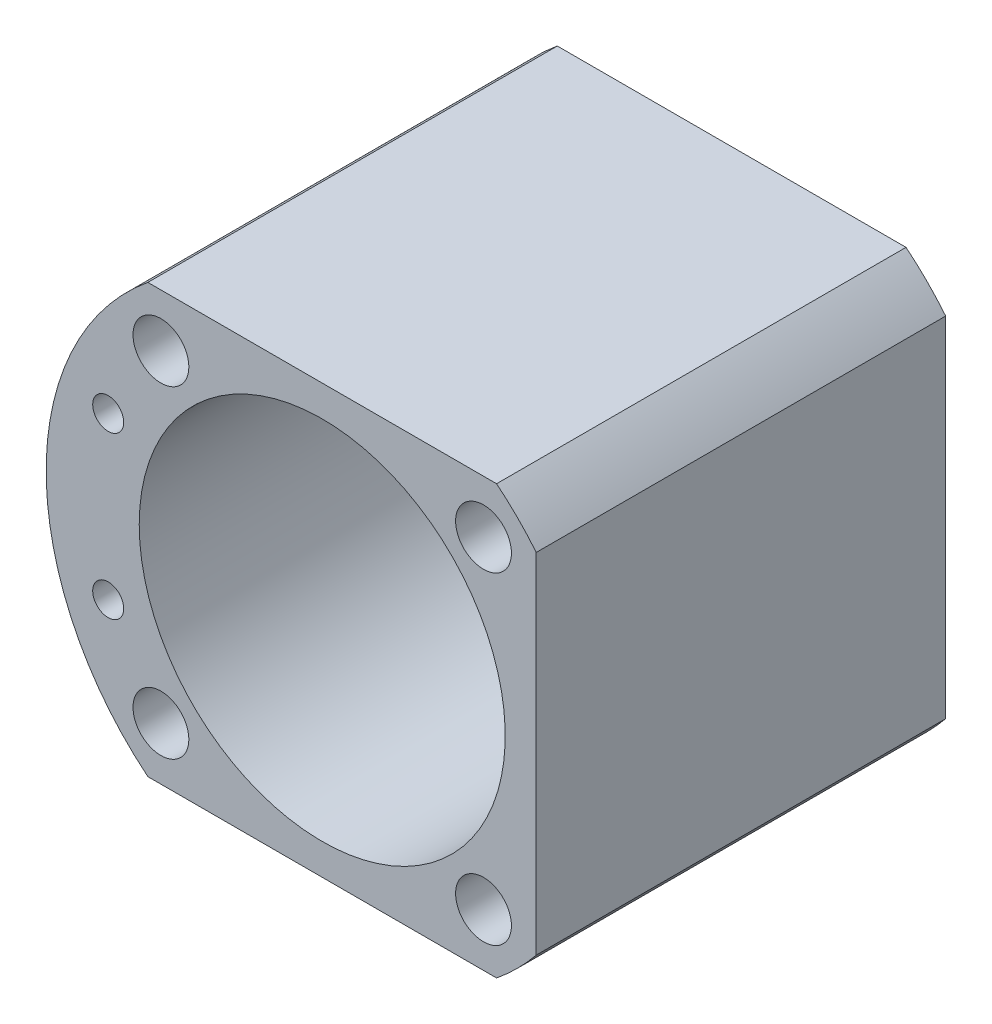
ISO-10303-21;
HEADER;
FILE_DESCRIPTION(('STEP AP214'),'2;1');
FILE_NAME('part.step','',(''),(''),'','','');
FILE_SCHEMA(('AUTOMOTIVE_DESIGN { 1 0 10303 214 1 1 1 1 }'));
ENDSEC;
DATA;
#1=APPLICATION_CONTEXT('core data for automotive mechanical design processes');
#2=APPLICATION_PROTOCOL_DEFINITION('international standard','automotive_design',2000,#1);
#3=PRODUCT_CONTEXT('',#1,'mechanical');
#4=PRODUCT('Part','Part','',(#3));
#5=PRODUCT_RELATED_PRODUCT_CATEGORY('part','',(#4));
#6=PRODUCT_DEFINITION_FORMATION('','',#4);
#7=PRODUCT_DEFINITION_CONTEXT('part definition',#1,'design');
#8=PRODUCT_DEFINITION('design','',#6,#7);
#9=PRODUCT_DEFINITION_SHAPE('','',#8);
#10=(LENGTH_UNIT() NAMED_UNIT(*) SI_UNIT(.MILLI.,.METRE.));
#11=(NAMED_UNIT(*) PLANE_ANGLE_UNIT() SI_UNIT($,.RADIAN.));
#12=(NAMED_UNIT(*) SI_UNIT($,.STERADIAN.) SOLID_ANGLE_UNIT());
#13=UNCERTAINTY_MEASURE_WITH_UNIT(LENGTH_MEASURE(1.E-05),#10,'distance_accuracy_value','');
#14=(GEOMETRIC_REPRESENTATION_CONTEXT(3) GLOBAL_UNCERTAINTY_ASSIGNED_CONTEXT((#13)) GLOBAL_UNIT_ASSIGNED_CONTEXT((#10,
#11,#12)) REPRESENTATION_CONTEXT('',''));
#15=CARTESIAN_POINT('',(0.,0.,0.));
#16=DIRECTION('',(0.,0.,1.));
#17=DIRECTION('',(1.,0.,0.));
#18=AXIS2_PLACEMENT_3D('',#15,#16,#17);
#19=CARTESIAN_POINT('',(0.,0.,66.));
#20=DIRECTION('',(0.,0.,-1.));
#21=DIRECTION('',(-1.,0.,0.));
#22=AXIS2_PLACEMENT_3D('',#19,#20,#21);
#23=CYLINDRICAL_SURFACE('',#22,44.5);
#24=CARTESIAN_POINT('',(0.,0.,0.));
#25=DIRECTION('',(0.,0.,1.));
#26=DIRECTION('',(1.,0.,0.));
#27=AXIS2_PLACEMENT_3D('',#24,#25,#26);
#28=CIRCLE('',#27,44.5);
#29=CARTESIAN_POINT('',(34.5,28.1069386451104,0.));
#30=VERTEX_POINT('',#29);
#31=CARTESIAN_POINT('',(28.1069386451104,34.5,0.));
#32=VERTEX_POINT('',#31);
#33=EDGE_CURVE('E101',#30,#32,#28,.T.);
#34=ORIENTED_EDGE('',*,*,#33,.T.);
#35=DIRECTION('',(0.,0.,-1.));
#36=VECTOR('',#35,1.);
#37=CARTESIAN_POINT('',(28.1069386451104,34.5,66.));
#38=LINE('',#37,#36);
#39=CARTESIAN_POINT('',(28.1069386451104,34.5,66.));
#40=VERTEX_POINT('',#39);
#41=EDGE_CURVE('E11',#40,#32,#38,.T.);
#42=ORIENTED_EDGE('',*,*,#41,.F.);
#43=CARTESIAN_POINT('',(0.,0.,66.));
#44=DIRECTION('',(0.,0.,1.));
#45=DIRECTION('',(1.,0.,0.));
#46=AXIS2_PLACEMENT_3D('',#43,#44,#45);
#47=CIRCLE('',#46,44.5);
#48=CARTESIAN_POINT('',(34.5,28.1069386451104,66.));
#49=VERTEX_POINT('',#48);
#50=EDGE_CURVE('E112',#49,#40,#47,.T.);
#51=ORIENTED_EDGE('',*,*,#50,.F.);
#52=DIRECTION('',(0.,0.,-1.));
#53=VECTOR('',#52,1.);
#54=CARTESIAN_POINT('',(34.5,28.1069386451104,66.));
#55=LINE('',#54,#53);
#56=EDGE_CURVE('E97',#49,#30,#55,.T.);
#57=ORIENTED_EDGE('',*,*,#56,.T.);
#58=EDGE_LOOP('',(#34,#42,#51,#57));
#59=FACE_BOUND('',#58,.T.);
#60=ADVANCED_FACE('F17',(#59),#23,.T.);
#61=CARTESIAN_POINT('',(28.1069386451104,34.5,66.));
#62=DIRECTION('',(0.,-1.,0.));
#63=DIRECTION('',(0.,0.,-1.));
#64=AXIS2_PLACEMENT_3D('',#61,#62,#63);
#65=PLANE('',#64);
#66=DIRECTION('',(-1.,0.,0.));
#67=VECTOR('',#66,1.);
#68=CARTESIAN_POINT('',(28.1069386451104,34.5,0.));
#69=LINE('',#68,#67);
#70=CARTESIAN_POINT('',(-28.1069386451104,34.5,0.));
#71=VERTEX_POINT('',#70);
#72=EDGE_CURVE('E104',#32,#71,#69,.T.);
#73=ORIENTED_EDGE('',*,*,#72,.T.);
#74=DIRECTION('',(0.,0.,-1.));
#75=VECTOR('',#74,1.);
#76=CARTESIAN_POINT('',(-28.1069386451104,34.5,66.));
#77=LINE('',#76,#75);
#78=CARTESIAN_POINT('',(-28.1069386451104,34.5,66.));
#79=VERTEX_POINT('',#78);
#80=EDGE_CURVE('E25',#79,#71,#77,.T.);
#81=ORIENTED_EDGE('',*,*,#80,.F.);
#82=DIRECTION('',(-1.,0.,0.));
#83=VECTOR('',#82,1.);
#84=CARTESIAN_POINT('',(28.1069386451104,34.5,66.));
#85=LINE('',#84,#83);
#86=EDGE_CURVE('E70',#40,#79,#85,.T.);
#87=ORIENTED_EDGE('',*,*,#86,.F.);
#88=ORIENTED_EDGE('',*,*,#41,.T.);
#89=EDGE_LOOP('',(#73,#81,#87,#88));
#90=FACE_BOUND('',#89,.T.);
#91=ADVANCED_FACE('F139',(#90),#65,.F.);
#92=CARTESIAN_POINT('',(0.,0.,66.));
#93=DIRECTION('',(0.,0.,-1.));
#94=DIRECTION('',(-1.,0.,0.));
#95=AXIS2_PLACEMENT_3D('',#92,#93,#94);
#96=CYLINDRICAL_SURFACE('',#95,44.5);
#97=CARTESIAN_POINT('',(0.,0.,0.));
#98=DIRECTION('',(0.,0.,1.));
#99=DIRECTION('',(1.,0.,0.));
#100=AXIS2_PLACEMENT_3D('',#97,#98,#99);
#101=CIRCLE('',#100,44.5);
#102=CARTESIAN_POINT('',(-28.1069386451104,-34.5,0.));
#103=VERTEX_POINT('',#102);
#104=EDGE_CURVE('E107',#71,#103,#101,.T.);
#105=ORIENTED_EDGE('',*,*,#104,.T.);
#106=DIRECTION('',(0.,0.,-1.));
#107=VECTOR('',#106,1.);
#108=CARTESIAN_POINT('',(-28.1069386451104,-34.5,66.));
#109=LINE('',#108,#107);
#110=CARTESIAN_POINT('',(-28.1069386451104,-34.5,66.));
#111=VERTEX_POINT('',#110);
#112=EDGE_CURVE('E92',#111,#103,#109,.T.);
#113=ORIENTED_EDGE('',*,*,#112,.F.);
#114=CARTESIAN_POINT('',(0.,0.,66.));
#115=DIRECTION('',(0.,0.,1.));
#116=DIRECTION('',(1.,0.,0.));
#117=AXIS2_PLACEMENT_3D('',#114,#115,#116);
#118=CIRCLE('',#117,44.5);
#119=EDGE_CURVE('E83',#79,#111,#118,.T.);
#120=ORIENTED_EDGE('',*,*,#119,.F.);
#121=ORIENTED_EDGE('',*,*,#80,.T.);
#122=EDGE_LOOP('',(#105,#113,#120,#121));
#123=FACE_BOUND('',#122,.T.);
#124=ADVANCED_FACE('F118',(#123),#96,.T.);
#125=CARTESIAN_POINT('',(-28.1069386451104,-34.5,66.));
#126=DIRECTION('',(0.,1.,0.));
#127=DIRECTION('',(0.,0.,1.));
#128=AXIS2_PLACEMENT_3D('',#125,#126,#127);
#129=PLANE('',#128);
#130=DIRECTION('',(1.,0.,0.));
#131=VECTOR('',#130,1.);
#132=CARTESIAN_POINT('',(-28.1069386451104,-34.5,0.));
#133=LINE('',#132,#131);
#134=CARTESIAN_POINT('',(28.1069386451104,-34.5,0.));
#135=VERTEX_POINT('',#134);
#136=EDGE_CURVE('E91',#103,#135,#133,.T.);
#137=ORIENTED_EDGE('',*,*,#136,.T.);
#138=DIRECTION('',(0.,0.,-1.));
#139=VECTOR('',#138,1.);
#140=CARTESIAN_POINT('',(28.1069386451104,-34.5,66.));
#141=LINE('',#140,#139);
#142=CARTESIAN_POINT('',(28.1069386451104,-34.5,66.));
#143=VERTEX_POINT('',#142);
#144=EDGE_CURVE('E88',#143,#135,#141,.T.);
#145=ORIENTED_EDGE('',*,*,#144,.F.);
#146=DIRECTION('',(1.,0.,0.));
#147=VECTOR('',#146,1.);
#148=CARTESIAN_POINT('',(-28.1069386451104,-34.5,66.));
#149=LINE('',#148,#147);
#150=EDGE_CURVE('E77',#111,#143,#149,.T.);
#151=ORIENTED_EDGE('',*,*,#150,.F.);
#152=ORIENTED_EDGE('',*,*,#112,.T.);
#153=EDGE_LOOP('',(#137,#145,#151,#152));
#154=FACE_BOUND('',#153,.T.);
#155=ADVANCED_FACE('F89',(#154),#129,.F.);
#156=CARTESIAN_POINT('',(0.,0.,66.));
#157=DIRECTION('',(0.,0.,-1.));
#158=DIRECTION('',(-1.,0.,0.));
#159=AXIS2_PLACEMENT_3D('',#156,#157,#158);
#160=CYLINDRICAL_SURFACE('',#159,44.5);
#161=CARTESIAN_POINT('',(0.,0.,0.));
#162=DIRECTION('',(0.,0.,1.));
#163=DIRECTION('',(1.,0.,0.));
#164=AXIS2_PLACEMENT_3D('',#161,#162,#163);
#165=CIRCLE('',#164,44.5);
#166=CARTESIAN_POINT('',(34.5,-28.1069386451104,0.));
#167=VERTEX_POINT('',#166);
#168=EDGE_CURVE('E56',#135,#167,#165,.T.);
#169=ORIENTED_EDGE('',*,*,#168,.T.);
#170=DIRECTION('',(0.,0.,-1.));
#171=VECTOR('',#170,1.);
#172=CARTESIAN_POINT('',(34.5,-28.1069386451104,66.));
#173=LINE('',#172,#171);
#174=CARTESIAN_POINT('',(34.5,-28.1069386451104,66.));
#175=VERTEX_POINT('',#174);
#176=EDGE_CURVE('E93',#175,#167,#173,.T.);
#177=ORIENTED_EDGE('',*,*,#176,.F.);
#178=CARTESIAN_POINT('',(0.,0.,66.));
#179=DIRECTION('',(0.,0.,1.));
#180=DIRECTION('',(1.,0.,0.));
#181=AXIS2_PLACEMENT_3D('',#178,#179,#180);
#182=CIRCLE('',#181,44.5);
#183=EDGE_CURVE('E81',#143,#175,#182,.T.);
#184=ORIENTED_EDGE('',*,*,#183,.F.);
#185=ORIENTED_EDGE('',*,*,#144,.T.);
#186=EDGE_LOOP('',(#169,#177,#184,#185));
#187=FACE_BOUND('',#186,.T.);
#188=ADVANCED_FACE('F95',(#187),#160,.T.);
#189=CARTESIAN_POINT('',(34.5,-28.1069386451104,66.));
#190=DIRECTION('',(-1.,0.,0.));
#191=DIRECTION('',(0.,0.,1.));
#192=AXIS2_PLACEMENT_3D('',#189,#190,#191);
#193=PLANE('',#192);
#194=DIRECTION('',(0.,1.,0.));
#195=VECTOR('',#194,1.);
#196=CARTESIAN_POINT('',(34.5,-28.1069386451104,0.));
#197=LINE('',#196,#195);
#198=EDGE_CURVE('E62',#167,#30,#197,.T.);
#199=ORIENTED_EDGE('',*,*,#198,.T.);
#200=ORIENTED_EDGE('',*,*,#56,.F.);
#201=DIRECTION('',(0.,1.,0.));
#202=VECTOR('',#201,1.);
#203=CARTESIAN_POINT('',(34.5,-28.1069386451104,66.));
#204=LINE('',#203,#202);
#205=EDGE_CURVE('E33',#175,#49,#204,.T.);
#206=ORIENTED_EDGE('',*,*,#205,.F.);
#207=ORIENTED_EDGE('',*,*,#176,.T.);
#208=EDGE_LOOP('',(#199,#200,#206,#207));
#209=FACE_BOUND('',#208,.T.);
#210=ADVANCED_FACE('F125',(#209),#193,.F.);
#211=CARTESIAN_POINT('',(0.,0.,66.));
#212=DIRECTION('',(0.,0.,1.));
#213=DIRECTION('',(1.,0.,0.));
#214=AXIS2_PLACEMENT_3D('',#211,#212,#213);
#215=PLANE('',#214);
#216=CARTESIAN_POINT('',(-34.5,13.,66.));
#217=DIRECTION('',(0.,0.,-1.));
#218=DIRECTION('',(-1.,0.,0.));
#219=AXIS2_PLACEMENT_3D('',#216,#217,#218);
#220=CIRCLE('',#219,2.5);
#221=CARTESIAN_POINT('',(-37.,13.,66.));
#222=VERTEX_POINT('',#221);
#223=EDGE_CURVE('E313',#222,#222,#220,.T.);
#224=ORIENTED_EDGE('',*,*,#223,.T.);
#225=EDGE_LOOP('',(#224));
#226=FACE_BOUND('',#225,.T.);
#227=CARTESIAN_POINT('',(-34.5,-13.,66.));
#228=DIRECTION('',(0.,0.,-1.));
#229=DIRECTION('',(-1.,0.,0.));
#230=AXIS2_PLACEMENT_3D('',#227,#228,#229);
#231=CIRCLE('',#230,2.5);
#232=CARTESIAN_POINT('',(-37.,-13.,66.));
#233=VERTEX_POINT('',#232);
#234=EDGE_CURVE('E325',#233,#233,#231,.T.);
#235=ORIENTED_EDGE('',*,*,#234,.T.);
#236=EDGE_LOOP('',(#235));
#237=FACE_BOUND('',#236,.T.);
#238=CARTESIAN_POINT('',(-26.,25.99750570693,66.));
#239=DIRECTION('',(0.,0.,1.));
#240=DIRECTION('',(1.,0.,0.));
#241=AXIS2_PLACEMENT_3D('',#238,#239,#240);
#242=CIRCLE('',#241,4.5);
#243=CARTESIAN_POINT('',(-21.5,25.99750570693,66.));
#244=VERTEX_POINT('',#243);
#245=EDGE_CURVE('E328',#244,#244,#242,.T.);
#246=ORIENTED_EDGE('',*,*,#245,.F.);
#247=EDGE_LOOP('',(#246));
#248=FACE_BOUND('',#247,.T.);
#249=CARTESIAN_POINT('',(26.,25.99750570693,66.));
#250=DIRECTION('',(0.,0.,1.));
#251=DIRECTION('',(1.,0.,0.));
#252=AXIS2_PLACEMENT_3D('',#249,#250,#251);
#253=CIRCLE('',#252,4.5);
#254=CARTESIAN_POINT('',(30.5,25.99750570693,66.));
#255=VERTEX_POINT('',#254);
#256=EDGE_CURVE('E334',#255,#255,#253,.T.);
#257=ORIENTED_EDGE('',*,*,#256,.F.);
#258=EDGE_LOOP('',(#257));
#259=FACE_BOUND('',#258,.T.);
#260=CARTESIAN_POINT('',(-26.,-26.00249429307,66.));
#261=DIRECTION('',(0.,0.,1.));
#262=DIRECTION('',(1.,0.,0.));
#263=AXIS2_PLACEMENT_3D('',#260,#261,#262);
#264=CIRCLE('',#263,4.5);
#265=CARTESIAN_POINT('',(-21.5,-26.00249429307,66.));
#266=VERTEX_POINT('',#265);
#267=EDGE_CURVE('E340',#266,#266,#264,.T.);
#268=ORIENTED_EDGE('',*,*,#267,.F.);
#269=EDGE_LOOP('',(#268));
#270=FACE_BOUND('',#269,.T.);
#271=CARTESIAN_POINT('',(26.,-26.00249429307,66.));
#272=DIRECTION('',(0.,0.,1.));
#273=DIRECTION('',(1.,0.,0.));
#274=AXIS2_PLACEMENT_3D('',#271,#272,#273);
#275=CIRCLE('',#274,4.5);
#276=CARTESIAN_POINT('',(30.5,-26.00249429307,66.));
#277=VERTEX_POINT('',#276);
#278=EDGE_CURVE('E346',#277,#277,#275,.T.);
#279=ORIENTED_EDGE('',*,*,#278,.F.);
#280=EDGE_LOOP('',(#279));
#281=FACE_BOUND('',#280,.T.);
#282=CARTESIAN_POINT('',(0.,0.,66.));
#283=DIRECTION('',(0.,0.,-1.));
#284=DIRECTION('',(-1.,0.,0.));
#285=AXIS2_PLACEMENT_3D('',#282,#283,#284);
#286=CIRCLE('',#285,29.5);
#287=CARTESIAN_POINT('',(-29.5,0.,66.));
#288=VERTEX_POINT('',#287);
#289=EDGE_CURVE('E105',#288,#288,#286,.T.);
#290=ORIENTED_EDGE('',*,*,#289,.T.);
#291=EDGE_LOOP('',(#290));
#292=FACE_BOUND('',#291,.T.);
#293=ORIENTED_EDGE('',*,*,#50,.T.);
#294=ORIENTED_EDGE('',*,*,#86,.T.);
#295=ORIENTED_EDGE('',*,*,#119,.T.);
#296=ORIENTED_EDGE('',*,*,#150,.T.);
#297=ORIENTED_EDGE('',*,*,#183,.T.);
#298=ORIENTED_EDGE('',*,*,#205,.T.);
#299=EDGE_LOOP('',(#293,#294,#295,#296,#297,#298));
#300=FACE_BOUND('',#299,.T.);
#301=ADVANCED_FACE('F79',(#226,#237,#248,#259,#270,#281,#292,#300),#215,.T.);
#302=CARTESIAN_POINT('',(0.,0.,0.));
#303=DIRECTION('',(0.,0.,1.));
#304=DIRECTION('',(1.,0.,0.));
#305=AXIS2_PLACEMENT_3D('',#302,#303,#304);
#306=PLANE('',#305);
#307=CARTESIAN_POINT('',(-34.5,13.,0.));
#308=DIRECTION('',(0.,0.,-1.));
#309=DIRECTION('',(-1.,0.,0.));
#310=AXIS2_PLACEMENT_3D('',#307,#308,#309);
#311=CIRCLE('',#310,5.8);
#312=CARTESIAN_POINT('',(-40.3,13.,0.));
#313=VERTEX_POINT('',#312);
#314=EDGE_CURVE('E306',#313,#313,#311,.T.);
#315=ORIENTED_EDGE('',*,*,#314,.F.);
#316=EDGE_LOOP('',(#315));
#317=FACE_BOUND('',#316,.T.);
#318=CARTESIAN_POINT('',(-34.5,-13.,0.));
#319=DIRECTION('',(0.,0.,-1.));
#320=DIRECTION('',(-1.,0.,0.));
#321=AXIS2_PLACEMENT_3D('',#318,#319,#320);
#322=CIRCLE('',#321,5.8);
#323=CARTESIAN_POINT('',(-40.3,-13.,0.));
#324=VERTEX_POINT('',#323);
#325=EDGE_CURVE('E316',#324,#324,#322,.T.);
#326=ORIENTED_EDGE('',*,*,#325,.F.);
#327=EDGE_LOOP('',(#326));
#328=FACE_BOUND('',#327,.T.);
#329=CARTESIAN_POINT('',(-26.,25.99750570693,0.));
#330=DIRECTION('',(0.,0.,1.));
#331=DIRECTION('',(1.,0.,0.));
#332=AXIS2_PLACEMENT_3D('',#329,#330,#331);
#333=CIRCLE('',#332,4.5);
#334=CARTESIAN_POINT('',(-21.5,25.99750570693,0.));
#335=VERTEX_POINT('',#334);
#336=EDGE_CURVE('E331',#335,#335,#333,.T.);
#337=ORIENTED_EDGE('',*,*,#336,.T.);
#338=EDGE_LOOP('',(#337));
#339=FACE_BOUND('',#338,.T.);
#340=CARTESIAN_POINT('',(26.,25.99750570693,0.));
#341=DIRECTION('',(0.,0.,1.));
#342=DIRECTION('',(1.,0.,0.));
#343=AXIS2_PLACEMENT_3D('',#340,#341,#342);
#344=CIRCLE('',#343,4.5);
#345=CARTESIAN_POINT('',(30.5,25.99750570693,0.));
#346=VERTEX_POINT('',#345);
#347=EDGE_CURVE('E337',#346,#346,#344,.T.);
#348=ORIENTED_EDGE('',*,*,#347,.T.);
#349=EDGE_LOOP('',(#348));
#350=FACE_BOUND('',#349,.T.);
#351=CARTESIAN_POINT('',(-26.,-26.00249429307,0.));
#352=DIRECTION('',(0.,0.,1.));
#353=DIRECTION('',(1.,0.,0.));
#354=AXIS2_PLACEMENT_3D('',#351,#352,#353);
#355=CIRCLE('',#354,4.5);
#356=CARTESIAN_POINT('',(-21.5,-26.00249429307,0.));
#357=VERTEX_POINT('',#356);
#358=EDGE_CURVE('E343',#357,#357,#355,.T.);
#359=ORIENTED_EDGE('',*,*,#358,.T.);
#360=EDGE_LOOP('',(#359));
#361=FACE_BOUND('',#360,.T.);
#362=CARTESIAN_POINT('',(26.,-26.00249429307,0.));
#363=DIRECTION('',(0.,0.,1.));
#364=DIRECTION('',(1.,0.,0.));
#365=AXIS2_PLACEMENT_3D('',#362,#363,#364);
#366=CIRCLE('',#365,4.5);
#367=CARTESIAN_POINT('',(30.5,-26.00249429307,0.));
#368=VERTEX_POINT('',#367);
#369=EDGE_CURVE('E349',#368,#368,#366,.T.);
#370=ORIENTED_EDGE('',*,*,#369,.T.);
#371=EDGE_LOOP('',(#370));
#372=FACE_BOUND('',#371,.T.);
#373=CARTESIAN_POINT('',(0.,0.,0.));
#374=DIRECTION('',(0.,0.,-1.));
#375=DIRECTION('',(-1.,0.,0.));
#376=AXIS2_PLACEMENT_3D('',#373,#374,#375);
#377=CIRCLE('',#376,29.5);
#378=CARTESIAN_POINT('',(-29.5,0.,0.));
#379=VERTEX_POINT('',#378);
#380=EDGE_CURVE('E352',#379,#379,#377,.T.);
#381=ORIENTED_EDGE('',*,*,#380,.F.);
#382=EDGE_LOOP('',(#381));
#383=FACE_BOUND('',#382,.T.);
#384=ORIENTED_EDGE('',*,*,#33,.F.);
#385=ORIENTED_EDGE('',*,*,#198,.F.);
#386=ORIENTED_EDGE('',*,*,#168,.F.);
#387=ORIENTED_EDGE('',*,*,#136,.F.);
#388=ORIENTED_EDGE('',*,*,#104,.F.);
#389=ORIENTED_EDGE('',*,*,#72,.F.);
#390=EDGE_LOOP('',(#384,#385,#386,#387,#388,#389));
#391=FACE_BOUND('',#390,.T.);
#392=ADVANCED_FACE('F121',(#317,#328,#339,#350,#361,#372,#383,#391),#306,.F.);
#393=CARTESIAN_POINT('',(0.,0.,66.));
#394=DIRECTION('',(0.,0.,-1.));
#395=DIRECTION('',(-1.,0.,0.));
#396=AXIS2_PLACEMENT_3D('',#393,#394,#395);
#397=CYLINDRICAL_SURFACE('',#396,29.5);
#398=ORIENTED_EDGE('',*,*,#289,.F.);
#399=EDGE_LOOP('',(#398));
#400=FACE_BOUND('',#399,.T.);
#401=ORIENTED_EDGE('',*,*,#380,.T.);
#402=EDGE_LOOP('',(#401));
#403=FACE_BOUND('',#402,.T.);
#404=ADVANCED_FACE('F185',(#400,#403),#397,.F.);
#405=CARTESIAN_POINT('',(26.,-26.00249429307,66.));
#406=DIRECTION('',(0.,0.,1.));
#407=DIRECTION('',(1.,0.,0.));
#408=AXIS2_PLACEMENT_3D('',#405,#406,#407);
#409=CYLINDRICAL_SURFACE('',#408,4.5);
#410=ORIENTED_EDGE('',*,*,#369,.F.);
#411=EDGE_LOOP('',(#410));
#412=FACE_BOUND('',#411,.T.);
#413=ORIENTED_EDGE('',*,*,#278,.T.);
#414=EDGE_LOOP('',(#413));
#415=FACE_BOUND('',#414,.T.);
#416=ADVANCED_FACE('F196',(#412,#415),#409,.F.);
#417=CARTESIAN_POINT('',(-26.,-26.00249429307,66.));
#418=DIRECTION('',(0.,0.,1.));
#419=DIRECTION('',(1.,0.,0.));
#420=AXIS2_PLACEMENT_3D('',#417,#418,#419);
#421=CYLINDRICAL_SURFACE('',#420,4.5);
#422=ORIENTED_EDGE('',*,*,#358,.F.);
#423=EDGE_LOOP('',(#422));
#424=FACE_BOUND('',#423,.T.);
#425=ORIENTED_EDGE('',*,*,#267,.T.);
#426=EDGE_LOOP('',(#425));
#427=FACE_BOUND('',#426,.T.);
#428=ADVANCED_FACE('F206',(#424,#427),#421,.F.);
#429=CARTESIAN_POINT('',(26.,25.99750570693,66.));
#430=DIRECTION('',(0.,0.,1.));
#431=DIRECTION('',(1.,0.,0.));
#432=AXIS2_PLACEMENT_3D('',#429,#430,#431);
#433=CYLINDRICAL_SURFACE('',#432,4.5);
#434=ORIENTED_EDGE('',*,*,#347,.F.);
#435=EDGE_LOOP('',(#434));
#436=FACE_BOUND('',#435,.T.);
#437=ORIENTED_EDGE('',*,*,#256,.T.);
#438=EDGE_LOOP('',(#437));
#439=FACE_BOUND('',#438,.T.);
#440=ADVANCED_FACE('F216',(#436,#439),#433,.F.);
#441=CARTESIAN_POINT('',(-26.,25.99750570693,66.));
#442=DIRECTION('',(0.,0.,1.));
#443=DIRECTION('',(1.,0.,0.));
#444=AXIS2_PLACEMENT_3D('',#441,#442,#443);
#445=CYLINDRICAL_SURFACE('',#444,4.5);
#446=ORIENTED_EDGE('',*,*,#336,.F.);
#447=EDGE_LOOP('',(#446));
#448=FACE_BOUND('',#447,.T.);
#449=ORIENTED_EDGE('',*,*,#245,.T.);
#450=EDGE_LOOP('',(#449));
#451=FACE_BOUND('',#450,.T.);
#452=ADVANCED_FACE('F226',(#448,#451),#445,.F.);
#453=CARTESIAN_POINT('',(-34.5,-13.,0.));
#454=DIRECTION('',(0.,0.,-1.));
#455=DIRECTION('',(-1.,0.,0.));
#456=AXIS2_PLACEMENT_3D('',#453,#454,#455);
#457=CYLINDRICAL_SURFACE('',#456,2.5);
#458=ORIENTED_EDGE('',*,*,#234,.F.);
#459=EDGE_LOOP('',(#458));
#460=FACE_BOUND('',#459,.T.);
#461=CARTESIAN_POINT('',(-34.5,-13.,1.3));
#462=DIRECTION('',(0.,0.,-1.));
#463=DIRECTION('',(-1.,0.,0.));
#464=AXIS2_PLACEMENT_3D('',#461,#462,#463);
#465=CIRCLE('',#464,2.5);
#466=CARTESIAN_POINT('',(-37.,-13.,1.3));
#467=VERTEX_POINT('',#466);
#468=EDGE_CURVE('E322',#467,#467,#465,.T.);
#469=ORIENTED_EDGE('',*,*,#468,.T.);
#470=EDGE_LOOP('',(#469));
#471=FACE_BOUND('',#470,.T.);
#472=ADVANCED_FACE('F235',(#460,#471),#457,.F.);
#473=CARTESIAN_POINT('',(-32.,-13.,1.3));
#474=DIRECTION('',(0.,0.,1.));
#475=DIRECTION('',(1.,0.,0.));
#476=AXIS2_PLACEMENT_3D('',#473,#474,#475);
#477=PLANE('',#476);
#478=ORIENTED_EDGE('',*,*,#468,.F.);
#479=EDGE_LOOP('',(#478));
#480=FACE_BOUND('',#479,.T.);
#481=CARTESIAN_POINT('',(-34.5,-13.,1.3));
#482=DIRECTION('',(0.,0.,-1.));
#483=DIRECTION('',(-1.,0.,0.));
#484=AXIS2_PLACEMENT_3D('',#481,#482,#483);
#485=CIRCLE('',#484,5.8);
#486=CARTESIAN_POINT('',(-40.3,-13.,1.3));
#487=VERTEX_POINT('',#486);
#488=EDGE_CURVE('E319',#487,#487,#485,.T.);
#489=ORIENTED_EDGE('',*,*,#488,.T.);
#490=EDGE_LOOP('',(#489));
#491=FACE_BOUND('',#490,.T.);
#492=ADVANCED_FACE('F244',(#480,#491),#477,.F.);
#493=CARTESIAN_POINT('',(-34.5,-13.,0.));
#494=DIRECTION('',(0.,0.,-1.));
#495=DIRECTION('',(-1.,0.,0.));
#496=AXIS2_PLACEMENT_3D('',#493,#494,#495);
#497=CYLINDRICAL_SURFACE('',#496,5.8);
#498=ORIENTED_EDGE('',*,*,#488,.F.);
#499=EDGE_LOOP('',(#498));
#500=FACE_BOUND('',#499,.T.);
#501=ORIENTED_EDGE('',*,*,#325,.T.);
#502=EDGE_LOOP('',(#501));
#503=FACE_BOUND('',#502,.T.);
#504=ADVANCED_FACE('F254',(#500,#503),#497,.F.);
#505=CARTESIAN_POINT('',(-34.5,13.,0.));
#506=DIRECTION('',(0.,0.,-1.));
#507=DIRECTION('',(-1.,0.,0.));
#508=AXIS2_PLACEMENT_3D('',#505,#506,#507);
#509=CYLINDRICAL_SURFACE('',#508,2.5);
#510=ORIENTED_EDGE('',*,*,#223,.F.);
#511=EDGE_LOOP('',(#510));
#512=FACE_BOUND('',#511,.T.);
#513=CARTESIAN_POINT('',(-34.5,13.,1.3));
#514=DIRECTION('',(0.,0.,-1.));
#515=DIRECTION('',(-1.,0.,0.));
#516=AXIS2_PLACEMENT_3D('',#513,#514,#515);
#517=CIRCLE('',#516,2.5);
#518=CARTESIAN_POINT('',(-37.,13.,1.3));
#519=VERTEX_POINT('',#518);
#520=EDGE_CURVE('E308',#519,#519,#517,.T.);
#521=ORIENTED_EDGE('',*,*,#520,.T.);
#522=EDGE_LOOP('',(#521));
#523=FACE_BOUND('',#522,.T.);
#524=ADVANCED_FACE('F264',(#512,#523),#509,.F.);
#525=CARTESIAN_POINT('',(-32.,13.,1.3));
#526=DIRECTION('',(0.,0.,1.));
#527=DIRECTION('',(1.,0.,0.));
#528=AXIS2_PLACEMENT_3D('',#525,#526,#527);
#529=PLANE('',#528);
#530=ORIENTED_EDGE('',*,*,#520,.F.);
#531=EDGE_LOOP('',(#530));
#532=FACE_BOUND('',#531,.T.);
#533=CARTESIAN_POINT('',(-34.5,13.,1.3));
#534=DIRECTION('',(0.,0.,-1.));
#535=DIRECTION('',(-1.,0.,0.));
#536=AXIS2_PLACEMENT_3D('',#533,#534,#535);
#537=CIRCLE('',#536,5.8);
#538=CARTESIAN_POINT('',(-40.3,13.,1.3));
#539=VERTEX_POINT('',#538);
#540=EDGE_CURVE('E303',#539,#539,#537,.T.);
#541=ORIENTED_EDGE('',*,*,#540,.T.);
#542=EDGE_LOOP('',(#541));
#543=FACE_BOUND('',#542,.T.);
#544=ADVANCED_FACE('F274',(#532,#543),#529,.F.);
#545=CARTESIAN_POINT('',(-34.5,13.,0.));
#546=DIRECTION('',(0.,0.,-1.));
#547=DIRECTION('',(-1.,0.,0.));
#548=AXIS2_PLACEMENT_3D('',#545,#546,#547);
#549=CYLINDRICAL_SURFACE('',#548,5.8);
#550=ORIENTED_EDGE('',*,*,#540,.F.);
#551=EDGE_LOOP('',(#550));
#552=FACE_BOUND('',#551,.T.);
#553=ORIENTED_EDGE('',*,*,#314,.T.);
#554=EDGE_LOOP('',(#553));
#555=FACE_BOUND('',#554,.T.);
#556=ADVANCED_FACE('F284',(#552,#555),#549,.F.);
#557=CLOSED_SHELL('',(#60,#91,#124,#155,#188,#210,#301,#392,#404,#416,#428,#440,#452,#472,#492,
#504,#524,#544,#556));
#558=MANIFOLD_SOLID_BREP('B1',#557);
#559=ADVANCED_BREP_SHAPE_REPRESENTATION('',(#18,#558),#14);
#560=SHAPE_DEFINITION_REPRESENTATION(#9,#559);
ENDSEC;
END-ISO-10303-21;
